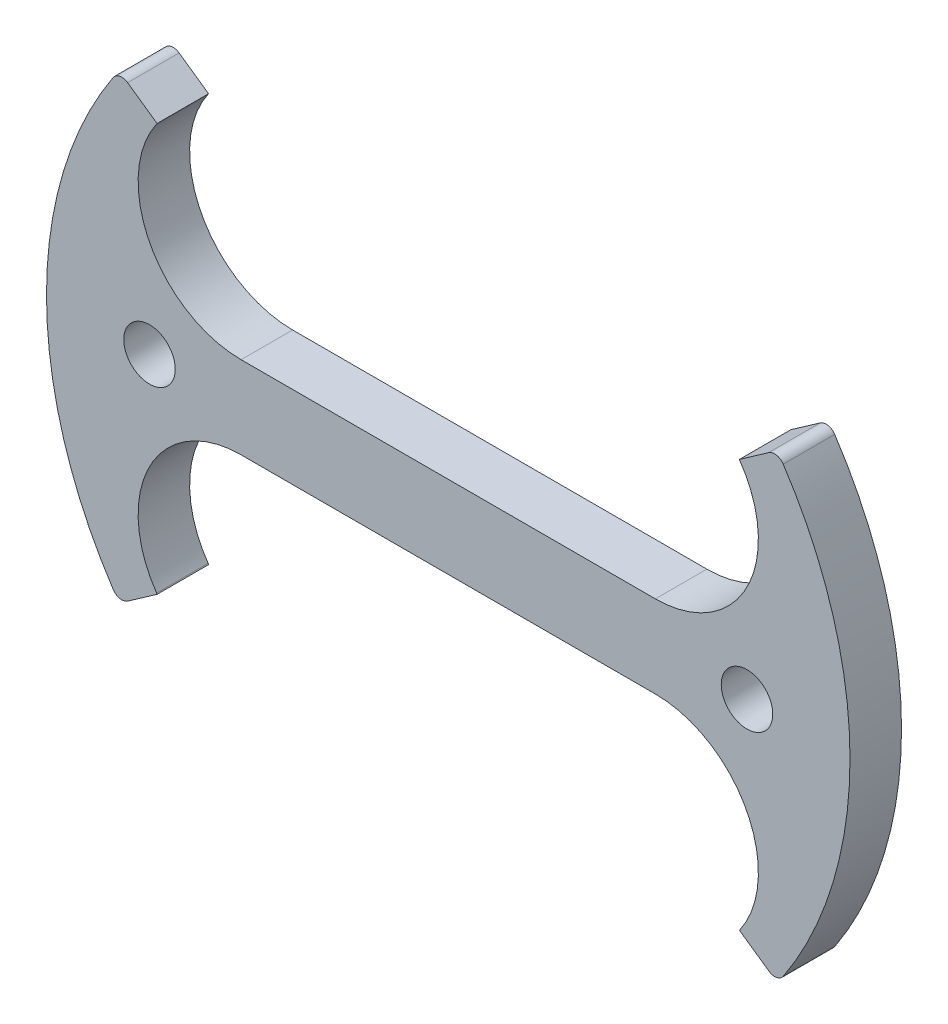
ISO-10303-21;
HEADER;
FILE_DESCRIPTION(('STEP AP214'),'2;1');
FILE_NAME('part.step','',(''),(''),'','','');
FILE_SCHEMA(('AUTOMOTIVE_DESIGN { 1 0 10303 214 1 1 1 1 }'));
ENDSEC;
DATA;
#1=APPLICATION_CONTEXT('core data for automotive mechanical design processes');
#2=APPLICATION_PROTOCOL_DEFINITION('international standard','automotive_design',2000,#1);
#3=PRODUCT_CONTEXT('',#1,'mechanical');
#4=PRODUCT('Part','Part','',(#3));
#5=PRODUCT_RELATED_PRODUCT_CATEGORY('part','',(#4));
#6=PRODUCT_DEFINITION_FORMATION('','',#4);
#7=PRODUCT_DEFINITION_CONTEXT('part definition',#1,'design');
#8=PRODUCT_DEFINITION('design','',#6,#7);
#9=PRODUCT_DEFINITION_SHAPE('','',#8);
#10=(LENGTH_UNIT() NAMED_UNIT(*) SI_UNIT(.MILLI.,.METRE.));
#11=(NAMED_UNIT(*) PLANE_ANGLE_UNIT() SI_UNIT($,.RADIAN.));
#12=(NAMED_UNIT(*) SI_UNIT($,.STERADIAN.) SOLID_ANGLE_UNIT());
#13=UNCERTAINTY_MEASURE_WITH_UNIT(LENGTH_MEASURE(1.E-05),#10,'distance_accuracy_value','');
#14=(GEOMETRIC_REPRESENTATION_CONTEXT(3) GLOBAL_UNCERTAINTY_ASSIGNED_CONTEXT((#13)) GLOBAL_UNIT_ASSIGNED_CONTEXT((#10,
#11,#12)) REPRESENTATION_CONTEXT('',''));
#15=CARTESIAN_POINT('',(0.,0.,0.));
#16=DIRECTION('',(0.,0.,1.));
#17=DIRECTION('',(1.,0.,0.));
#18=AXIS2_PLACEMENT_3D('',#15,#16,#17);
#19=CARTESIAN_POINT('',(0.,0.,6.35));
#20=DIRECTION('',(0.,0.,1.));
#21=DIRECTION('',(1.,0.,0.));
#22=AXIS2_PLACEMENT_3D('',#19,#20,#21);
#23=PLANE('',#22);
#24=CARTESIAN_POINT('',(36.83,0.,6.35));
#25=DIRECTION('',(0.,0.,-1.));
#26=DIRECTION('',(-1.,0.,0.));
#27=AXIS2_PLACEMENT_3D('',#24,#25,#26);
#28=CIRCLE('',#27,3.175);
#29=CARTESIAN_POINT('',(33.655,0.,6.35));
#30=VERTEX_POINT('',#29);
#31=EDGE_CURVE('E309',#30,#30,#28,.T.);
#32=ORIENTED_EDGE('',*,*,#31,.T.);
#33=EDGE_LOOP('',(#32));
#34=FACE_BOUND('',#33,.T.);
#35=CARTESIAN_POINT('',(-36.83,0.,6.35));
#36=DIRECTION('',(0.,0.,-1.));
#37=DIRECTION('',(1.,0.,0.));
#38=AXIS2_PLACEMENT_3D('',#35,#36,#37);
#39=CIRCLE('',#38,3.175);
#40=CARTESIAN_POINT('',(-33.655,0.,6.35));
#41=VERTEX_POINT('',#40);
#42=EDGE_CURVE('E467',#41,#41,#39,.T.);
#43=ORIENTED_EDGE('',*,*,#42,.T.);
#44=EDGE_LOOP('',(#43));
#45=FACE_BOUND('',#44,.T.);
#46=CARTESIAN_POINT('',(0.,0.,6.35));
#47=DIRECTION('',(0.,0.,1.));
#48=DIRECTION('',(1.,0.,0.));
#49=AXIS2_PLACEMENT_3D('',#46,#47,#48);
#50=CIRCLE('',#49,49.53);
#51=CARTESIAN_POINT('',(41.3142699154683,-27.3194436501153,6.35));
#52=VERTEX_POINT('',#51);
#53=CARTESIAN_POINT('',(41.2980489242587,27.343958291541,6.35));
#54=VERTEX_POINT('',#53);
#55=EDGE_CURVE('E216',#52,#54,#50,.T.);
#56=ORIENTED_EDGE('',*,*,#55,.T.);
#57=CARTESIAN_POINT('',(40.2391245928675,26.6428311558604,6.35));
#58=DIRECTION('',(0.,0.,1.));
#59=DIRECTION('',(1.,0.,0.));
#60=AXIS2_PLACEMENT_3D('',#57,#58,#59);
#61=CIRCLE('',#60,1.27);
#62=CARTESIAN_POINT('',(39.5103738420132,27.6829380461026,6.35));
#63=VERTEX_POINT('',#62);
#64=EDGE_CURVE('E11',#54,#63,#61,.T.);
#65=ORIENTED_EDGE('',*,*,#64,.T.);
#66=DIRECTION('',(-0.81898180334033,-0.573819488861628,0.));
#67=VECTOR('',#66,1.);
#68=CARTESIAN_POINT('',(40.5641687194466,28.4212792833164,6.35));
#69=LINE('',#68,#67);
#70=CARTESIAN_POINT('',(35.8836877133566,25.1419009044722,6.35));
#71=VERTEX_POINT('',#70);
#72=EDGE_CURVE('E178',#63,#71,#69,.T.);
#73=ORIENTED_EDGE('',*,*,#72,.T.);
#74=CARTESIAN_POINT('',(0.,0.,6.35));
#75=DIRECTION('',(0.,0.,1.));
#76=DIRECTION('',(1.,0.,0.));
#77=AXIS2_PLACEMENT_3D('',#74,#75,#76);
#78=CIRCLE('',#77,43.815);
#79=CARTESIAN_POINT('',(35.9568589082948,25.0371428571429,6.35));
#80=VERTEX_POINT('',#79);
#81=EDGE_CURVE('E185',#80,#71,#78,.T.);
#82=ORIENTED_EDGE('',*,*,#81,.F.);
#83=CARTESIAN_POINT('',(25.5345809638615,17.78,6.35));
#84=DIRECTION('',(0.,0.,1.));
#85=DIRECTION('',(1.,0.,0.));
#86=AXIS2_PLACEMENT_3D('',#83,#84,#85);
#87=CIRCLE('',#86,12.7);
#88=CARTESIAN_POINT('',(25.5345809638615,5.08,6.35));
#89=VERTEX_POINT('',#88);
#90=EDGE_CURVE('E228',#89,#80,#87,.T.);
#91=ORIENTED_EDGE('',*,*,#90,.F.);
#92=DIRECTION('',(1.,0.,0.));
#93=VECTOR('',#92,1.);
#94=CARTESIAN_POINT('',(-43.5195108543283,5.08,6.35));
#95=LINE('',#94,#93);
#96=CARTESIAN_POINT('',(-25.5345809638615,5.08,6.35));
#97=VERTEX_POINT('',#96);
#98=EDGE_CURVE('E203',#97,#89,#95,.T.);
#99=ORIENTED_EDGE('',*,*,#98,.F.);
#100=CARTESIAN_POINT('',(-25.5345809638615,17.78,6.35));
#101=DIRECTION('',(0.,0.,1.));
#102=DIRECTION('',(1.,0.,0.));
#103=AXIS2_PLACEMENT_3D('',#100,#101,#102);
#104=CIRCLE('',#103,12.7);
#105=CARTESIAN_POINT('',(-35.9568589082948,25.0371428571429,6.35));
#106=VERTEX_POINT('',#105);
#107=EDGE_CURVE('E240',#106,#97,#104,.T.);
#108=ORIENTED_EDGE('',*,*,#107,.F.);
#109=CARTESIAN_POINT('',(-35.8986027672387,25.1206,6.35));
#110=VERTEX_POINT('',#109);
#111=EDGE_CURVE('E204',#110,#106,#78,.T.);
#112=ORIENTED_EDGE('',*,*,#111,.F.);
#113=DIRECTION('',(-0.819322213105985,0.573333333333333,0.));
#114=VECTOR('',#113,1.);
#115=CARTESIAN_POINT('',(-35.8986027672387,25.1206,6.35));
#116=LINE('',#115,#114);
#117=CARTESIAN_POINT('',(-39.5267963278921,27.6594843056289,6.35));
#118=VERTEX_POINT('',#117);
#119=EDGE_CURVE('E190',#110,#118,#116,.T.);
#120=ORIENTED_EDGE('',*,*,#119,.T.);
#121=CARTESIAN_POINT('',(-40.2549296612255,26.6189450949843,6.35));
#122=DIRECTION('',(0.,0.,1.));
#123=DIRECTION('',(1.,0.,0.));
#124=AXIS2_PLACEMENT_3D('',#121,#122,#123);
#125=CIRCLE('',#124,1.27);
#126=CARTESIAN_POINT('',(-41.3142699154682,27.3194436501155,6.35));
#127=VERTEX_POINT('',#126);
#128=EDGE_CURVE('E266',#118,#127,#125,.T.);
#129=ORIENTED_EDGE('',*,*,#128,.T.);
#130=CARTESIAN_POINT('',(-41.2980489242587,-27.343958291541,6.35));
#131=VERTEX_POINT('',#130);
#132=EDGE_CURVE('E218',#127,#131,#50,.T.);
#133=ORIENTED_EDGE('',*,*,#132,.T.);
#134=CARTESIAN_POINT('',(-40.2391245928675,-26.6428311558604,6.35));
#135=DIRECTION('',(0.,0.,1.));
#136=DIRECTION('',(1.,0.,0.));
#137=AXIS2_PLACEMENT_3D('',#134,#135,#136);
#138=CIRCLE('',#137,1.27);
#139=CARTESIAN_POINT('',(-39.5103738420132,-27.6829380461027,6.35));
#140=VERTEX_POINT('',#139);
#141=EDGE_CURVE('E278',#131,#140,#138,.T.);
#142=ORIENTED_EDGE('',*,*,#141,.T.);
#143=DIRECTION('',(0.818981803340331,0.573819488861628,0.));
#144=VECTOR('',#143,1.);
#145=CARTESIAN_POINT('',(-35.8836877133566,-25.1419009044722,6.35));
#146=LINE('',#145,#144);
#147=CARTESIAN_POINT('',(-35.8836877133566,-25.1419009044722,6.35));
#148=VERTEX_POINT('',#147);
#149=EDGE_CURVE('E315',#140,#148,#146,.T.);
#150=ORIENTED_EDGE('',*,*,#149,.T.);
#151=CARTESIAN_POINT('',(0.,0.,6.35));
#152=DIRECTION('',(0.,0.,1.));
#153=DIRECTION('',(1.,0.,0.));
#154=AXIS2_PLACEMENT_3D('',#151,#152,#153);
#155=CIRCLE('',#154,43.815);
#156=CARTESIAN_POINT('',(-35.9568589082948,-25.0371428571429,6.35));
#157=VERTEX_POINT('',#156);
#158=EDGE_CURVE('E320',#157,#148,#155,.T.);
#159=ORIENTED_EDGE('',*,*,#158,.F.);
#160=CARTESIAN_POINT('',(-25.5345809638615,-17.78,6.35));
#161=DIRECTION('',(0.,0.,1.));
#162=DIRECTION('',(1.,0.,0.));
#163=AXIS2_PLACEMENT_3D('',#160,#161,#162);
#164=CIRCLE('',#163,12.7);
#165=CARTESIAN_POINT('',(-25.5345809638615,-5.08000000000001,6.35));
#166=VERTEX_POINT('',#165);
#167=EDGE_CURVE('E258',#166,#157,#164,.T.);
#168=ORIENTED_EDGE('',*,*,#167,.F.);
#169=DIRECTION('',(-1.,0.,0.));
#170=VECTOR('',#169,1.);
#171=CARTESIAN_POINT('',(-43.5195108543283,-5.08000000000001,6.35));
#172=LINE('',#171,#170);
#173=CARTESIAN_POINT('',(25.5345809638615,-5.08000000000001,6.35));
#174=VERTEX_POINT('',#173);
#175=EDGE_CURVE('E318',#174,#166,#172,.T.);
#176=ORIENTED_EDGE('',*,*,#175,.F.);
#177=CARTESIAN_POINT('',(25.5345809638615,-17.78,6.35));
#178=DIRECTION('',(0.,0.,1.));
#179=DIRECTION('',(1.,0.,0.));
#180=AXIS2_PLACEMENT_3D('',#177,#178,#179);
#181=CIRCLE('',#180,12.7);
#182=CARTESIAN_POINT('',(35.9568589082948,-25.0371428571428,6.35));
#183=VERTEX_POINT('',#182);
#184=EDGE_CURVE('E247',#183,#174,#181,.T.);
#185=ORIENTED_EDGE('',*,*,#184,.F.);
#186=CARTESIAN_POINT('',(35.8986027672388,-25.1205999999998,6.35));
#187=VERTEX_POINT('',#186);
#188=EDGE_CURVE('E321',#187,#183,#155,.T.);
#189=ORIENTED_EDGE('',*,*,#188,.F.);
#190=DIRECTION('',(0.819322213105986,-0.573333333333332,0.));
#191=VECTOR('',#190,1.);
#192=CARTESIAN_POINT('',(40.5810292151395,-28.3971999999998,6.35));
#193=LINE('',#192,#191);
#194=CARTESIAN_POINT('',(39.5267963278922,-27.6594843056288,6.35));
#195=VERTEX_POINT('',#194);
#196=EDGE_CURVE('E310',#187,#195,#193,.T.);
#197=ORIENTED_EDGE('',*,*,#196,.T.);
#198=CARTESIAN_POINT('',(40.2549296612256,-26.6189450949842,6.35));
#199=DIRECTION('',(0.,0.,1.));
#200=DIRECTION('',(1.,0.,0.));
#201=AXIS2_PLACEMENT_3D('',#198,#199,#200);
#202=CIRCLE('',#201,1.27);
#203=EDGE_CURVE('E288',#195,#52,#202,.T.);
#204=ORIENTED_EDGE('',*,*,#203,.T.);
#205=EDGE_LOOP('',(#56,#65,#73,#82,#91,#99,#108,#112,#120,#129,#133,#142,#150,#159,#168,#176,
#185,#189,#197,#204));
#206=FACE_BOUND('',#205,.T.);
#207=ADVANCED_FACE('F41',(#34,#45,#206),#23,.T.);
#208=CARTESIAN_POINT('',(0.,0.,0.));
#209=DIRECTION('',(0.,0.,1.));
#210=DIRECTION('',(1.,0.,0.));
#211=AXIS2_PLACEMENT_3D('',#208,#209,#210);
#212=PLANE('',#211);
#213=CARTESIAN_POINT('',(36.83,0.,0.));
#214=DIRECTION('',(0.,0.,-1.));
#215=DIRECTION('',(-1.,0.,0.));
#216=AXIS2_PLACEMENT_3D('',#213,#214,#215);
#217=CIRCLE('',#216,3.175);
#218=CARTESIAN_POINT('',(33.655,0.,0.));
#219=VERTEX_POINT('',#218);
#220=EDGE_CURVE('E462',#219,#219,#217,.T.);
#221=ORIENTED_EDGE('',*,*,#220,.F.);
#222=EDGE_LOOP('',(#221));
#223=FACE_BOUND('',#222,.T.);
#224=CARTESIAN_POINT('',(-36.83,0.,0.));
#225=DIRECTION('',(0.,0.,-1.));
#226=DIRECTION('',(1.,0.,0.));
#227=AXIS2_PLACEMENT_3D('',#224,#225,#226);
#228=CIRCLE('',#227,3.175);
#229=CARTESIAN_POINT('',(-33.655,0.,0.));
#230=VERTEX_POINT('',#229);
#231=EDGE_CURVE('E465',#230,#230,#228,.T.);
#232=ORIENTED_EDGE('',*,*,#231,.F.);
#233=EDGE_LOOP('',(#232));
#234=FACE_BOUND('',#233,.T.);
#235=DIRECTION('',(-0.81898180334033,-0.573819488861628,0.));
#236=VECTOR('',#235,1.);
#237=CARTESIAN_POINT('',(40.5641687194466,28.4212792833164,0.));
#238=LINE('',#237,#236);
#239=CARTESIAN_POINT('',(39.5103738420132,27.6829380461026,0.));
#240=VERTEX_POINT('',#239);
#241=CARTESIAN_POINT('',(35.8836877133566,25.1419009044722,0.));
#242=VERTEX_POINT('',#241);
#243=EDGE_CURVE('E192',#240,#242,#238,.T.);
#244=ORIENTED_EDGE('',*,*,#243,.F.);
#245=CARTESIAN_POINT('',(40.2391245928675,26.6428311558604,0.));
#246=DIRECTION('',(0.,0.,1.));
#247=DIRECTION('',(1.,0.,0.));
#248=AXIS2_PLACEMENT_3D('',#245,#246,#247);
#249=CIRCLE('',#248,1.27);
#250=CARTESIAN_POINT('',(41.2980489242587,27.343958291541,0.));
#251=VERTEX_POINT('',#250);
#252=EDGE_CURVE('E62',#240,#251,#249,.F.);
#253=ORIENTED_EDGE('',*,*,#252,.T.);
#254=CARTESIAN_POINT('',(0.,0.,0.));
#255=DIRECTION('',(0.,0.,1.));
#256=DIRECTION('',(1.,0.,0.));
#257=AXIS2_PLACEMENT_3D('',#254,#255,#256);
#258=CIRCLE('',#257,49.53);
#259=CARTESIAN_POINT('',(41.3142699154683,-27.3194436501153,0.));
#260=VERTEX_POINT('',#259);
#261=EDGE_CURVE('E207',#260,#251,#258,.T.);
#262=ORIENTED_EDGE('',*,*,#261,.F.);
#263=CARTESIAN_POINT('',(40.2549296612256,-26.6189450949842,0.));
#264=DIRECTION('',(0.,0.,1.));
#265=DIRECTION('',(1.,0.,0.));
#266=AXIS2_PLACEMENT_3D('',#263,#264,#265);
#267=CIRCLE('',#266,1.27);
#268=CARTESIAN_POINT('',(39.5267963278922,-27.6594843056288,0.));
#269=VERTEX_POINT('',#268);
#270=EDGE_CURVE('E283',#260,#269,#267,.F.);
#271=ORIENTED_EDGE('',*,*,#270,.T.);
#272=DIRECTION('',(0.819322213105986,-0.573333333333332,0.));
#273=VECTOR('',#272,1.);
#274=CARTESIAN_POINT('',(40.5810292151395,-28.3971999999998,0.));
#275=LINE('',#274,#273);
#276=CARTESIAN_POINT('',(35.8986027672388,-25.1205999999998,0.));
#277=VERTEX_POINT('',#276);
#278=EDGE_CURVE('E296',#277,#269,#275,.T.);
#279=ORIENTED_EDGE('',*,*,#278,.F.);
#280=CARTESIAN_POINT('',(0.,0.,0.));
#281=DIRECTION('',(0.,0.,1.));
#282=DIRECTION('',(1.,0.,0.));
#283=AXIS2_PLACEMENT_3D('',#280,#281,#282);
#284=CIRCLE('',#283,43.815);
#285=CARTESIAN_POINT('',(35.9568589082948,-25.0371428571428,0.));
#286=VERTEX_POINT('',#285);
#287=EDGE_CURVE('E305',#277,#286,#284,.T.);
#288=ORIENTED_EDGE('',*,*,#287,.T.);
#289=CARTESIAN_POINT('',(25.5345809638615,-17.78,0.));
#290=DIRECTION('',(0.,0.,1.));
#291=DIRECTION('',(1.,0.,0.));
#292=AXIS2_PLACEMENT_3D('',#289,#290,#291);
#293=CIRCLE('',#292,12.7);
#294=CARTESIAN_POINT('',(25.5345809638615,-5.08000000000001,0.));
#295=VERTEX_POINT('',#294);
#296=EDGE_CURVE('E249',#295,#286,#293,.F.);
#297=ORIENTED_EDGE('',*,*,#296,.F.);
#298=DIRECTION('',(-1.,0.,0.));
#299=VECTOR('',#298,1.);
#300=CARTESIAN_POINT('',(-43.5195108543283,-5.08000000000001,0.));
#301=LINE('',#300,#299);
#302=CARTESIAN_POINT('',(-25.5345809638615,-5.08000000000001,0.));
#303=VERTEX_POINT('',#302);
#304=EDGE_CURVE('E208',#295,#303,#301,.T.);
#305=ORIENTED_EDGE('',*,*,#304,.T.);
#306=CARTESIAN_POINT('',(-25.5345809638615,-17.78,0.));
#307=DIRECTION('',(0.,0.,1.));
#308=DIRECTION('',(1.,0.,0.));
#309=AXIS2_PLACEMENT_3D('',#306,#307,#308);
#310=CIRCLE('',#309,12.7);
#311=CARTESIAN_POINT('',(-35.9568589082948,-25.0371428571429,0.));
#312=VERTEX_POINT('',#311);
#313=EDGE_CURVE('E264',#312,#303,#310,.F.);
#314=ORIENTED_EDGE('',*,*,#313,.F.);
#315=CARTESIAN_POINT('',(-35.8836877133566,-25.1419009044722,0.));
#316=VERTEX_POINT('',#315);
#317=EDGE_CURVE('E322',#312,#316,#284,.T.);
#318=ORIENTED_EDGE('',*,*,#317,.T.);
#319=DIRECTION('',(0.818981803340331,0.573819488861628,0.));
#320=VECTOR('',#319,1.);
#321=CARTESIAN_POINT('',(-35.8836877133566,-25.1419009044722,0.));
#322=LINE('',#321,#320);
#323=CARTESIAN_POINT('',(-39.5103738420132,-27.6829380461027,0.));
#324=VERTEX_POINT('',#323);
#325=EDGE_CURVE('E295',#324,#316,#322,.T.);
#326=ORIENTED_EDGE('',*,*,#325,.F.);
#327=CARTESIAN_POINT('',(-40.2391245928675,-26.6428311558604,0.));
#328=DIRECTION('',(0.,0.,1.));
#329=DIRECTION('',(1.,0.,0.));
#330=AXIS2_PLACEMENT_3D('',#327,#328,#329);
#331=CIRCLE('',#330,1.27);
#332=CARTESIAN_POINT('',(-41.2980489242587,-27.343958291541,0.));
#333=VERTEX_POINT('',#332);
#334=EDGE_CURVE('E273',#324,#333,#331,.F.);
#335=ORIENTED_EDGE('',*,*,#334,.T.);
#336=CARTESIAN_POINT('',(-41.3142699154682,27.3194436501155,0.));
#337=VERTEX_POINT('',#336);
#338=EDGE_CURVE('E217',#337,#333,#258,.T.);
#339=ORIENTED_EDGE('',*,*,#338,.F.);
#340=CARTESIAN_POINT('',(-40.2549296612255,26.6189450949843,0.));
#341=DIRECTION('',(0.,0.,1.));
#342=DIRECTION('',(1.,0.,0.));
#343=AXIS2_PLACEMENT_3D('',#340,#341,#342);
#344=CIRCLE('',#343,1.27);
#345=CARTESIAN_POINT('',(-39.5267963278921,27.6594843056289,0.));
#346=VERTEX_POINT('',#345);
#347=EDGE_CURVE('E267',#337,#346,#344,.F.);
#348=ORIENTED_EDGE('',*,*,#347,.T.);
#349=DIRECTION('',(-0.819322213105985,0.573333333333333,0.));
#350=VECTOR('',#349,1.);
#351=CARTESIAN_POINT('',(-35.8986027672387,25.1206,0.));
#352=LINE('',#351,#350);
#353=CARTESIAN_POINT('',(-35.8986027672387,25.1206,0.));
#354=VERTEX_POINT('',#353);
#355=EDGE_CURVE('E189',#354,#346,#352,.T.);
#356=ORIENTED_EDGE('',*,*,#355,.F.);
#357=CARTESIAN_POINT('',(0.,0.,0.));
#358=DIRECTION('',(0.,0.,1.));
#359=DIRECTION('',(1.,0.,0.));
#360=AXIS2_PLACEMENT_3D('',#357,#358,#359);
#361=CIRCLE('',#360,43.815);
#362=CARTESIAN_POINT('',(-35.9568589082948,25.0371428571429,0.));
#363=VERTEX_POINT('',#362);
#364=EDGE_CURVE('E214',#354,#363,#361,.T.);
#365=ORIENTED_EDGE('',*,*,#364,.T.);
#366=CARTESIAN_POINT('',(-25.5345809638615,17.78,0.));
#367=DIRECTION('',(0.,0.,1.));
#368=DIRECTION('',(1.,0.,0.));
#369=AXIS2_PLACEMENT_3D('',#366,#367,#368);
#370=CIRCLE('',#369,12.7);
#371=CARTESIAN_POINT('',(-25.5345809638615,5.08,0.));
#372=VERTEX_POINT('',#371);
#373=EDGE_CURVE('E237',#372,#363,#370,.F.);
#374=ORIENTED_EDGE('',*,*,#373,.F.);
#375=DIRECTION('',(1.,0.,0.));
#376=VECTOR('',#375,1.);
#377=CARTESIAN_POINT('',(-43.5195108543283,5.08,0.));
#378=LINE('',#377,#376);
#379=CARTESIAN_POINT('',(25.5345809638615,5.08,0.));
#380=VERTEX_POINT('',#379);
#381=EDGE_CURVE('E206',#372,#380,#378,.T.);
#382=ORIENTED_EDGE('',*,*,#381,.T.);
#383=CARTESIAN_POINT('',(25.5345809638615,17.78,0.));
#384=DIRECTION('',(0.,0.,1.));
#385=DIRECTION('',(1.,0.,0.));
#386=AXIS2_PLACEMENT_3D('',#383,#384,#385);
#387=CIRCLE('',#386,12.7);
#388=CARTESIAN_POINT('',(35.9568589082948,25.0371428571429,0.));
#389=VERTEX_POINT('',#388);
#390=EDGE_CURVE('E226',#389,#380,#387,.F.);
#391=ORIENTED_EDGE('',*,*,#390,.F.);
#392=EDGE_CURVE('E212',#389,#242,#361,.T.);
#393=ORIENTED_EDGE('',*,*,#392,.T.);
#394=EDGE_LOOP('',(#244,#253,#262,#271,#279,#288,#297,#305,#314,#318,#326,#335,#339,#348,#356,
#365,#374,#382,#391,#393));
#395=FACE_BOUND('',#394,.T.);
#396=ADVANCED_FACE('F291',(#223,#234,#395),#212,.F.);
#397=CARTESIAN_POINT('',(0.,0.,6.35));
#398=DIRECTION('',(0.,0.,-1.));
#399=DIRECTION('',(-1.,0.,0.));
#400=AXIS2_PLACEMENT_3D('',#397,#398,#399);
#401=CYLINDRICAL_SURFACE('',#400,49.53);
#402=ORIENTED_EDGE('',*,*,#261,.T.);
#403=DIRECTION('',(0.,0.,-1.));
#404=VECTOR('',#403,1.);
#405=CARTESIAN_POINT('',(41.2980489242587,27.343958291541,6.35));
#406=LINE('',#405,#404);
#407=EDGE_CURVE('E47',#251,#54,#406,.F.);
#408=ORIENTED_EDGE('',*,*,#407,.T.);
#409=ORIENTED_EDGE('',*,*,#55,.F.);
#410=DIRECTION('',(0.,0.,-1.));
#411=VECTOR('',#410,1.);
#412=CARTESIAN_POINT('',(41.3142699154683,-27.3194436501153,6.35));
#413=LINE('',#412,#411);
#414=EDGE_CURVE('E284',#52,#260,#413,.T.);
#415=ORIENTED_EDGE('',*,*,#414,.T.);
#416=EDGE_LOOP('',(#402,#408,#409,#415));
#417=FACE_BOUND('',#416,.T.);
#418=ADVANCED_FACE('F407',(#417),#401,.T.);
#419=CARTESIAN_POINT('',(0.,0.,6.35));
#420=DIRECTION('',(0.,0.,-1.));
#421=DIRECTION('',(-1.,0.,0.));
#422=AXIS2_PLACEMENT_3D('',#419,#420,#421);
#423=CYLINDRICAL_SURFACE('',#422,43.815);
#424=ORIENTED_EDGE('',*,*,#81,.T.);
#425=DIRECTION('',(0.,0.,-1.));
#426=VECTOR('',#425,1.);
#427=CARTESIAN_POINT('',(35.8836877133566,25.1419009044722,6.35));
#428=LINE('',#427,#426);
#429=EDGE_CURVE('E191',#71,#242,#428,.T.);
#430=ORIENTED_EDGE('',*,*,#429,.T.);
#431=ORIENTED_EDGE('',*,*,#392,.F.);
#432=DIRECTION('',(0.,0.,-1.));
#433=VECTOR('',#432,1.);
#434=CARTESIAN_POINT('',(35.9568589082948,25.0371428571429,6.35));
#435=LINE('',#434,#433);
#436=EDGE_CURVE('E205',#389,#80,#435,.F.);
#437=ORIENTED_EDGE('',*,*,#436,.T.);
#438=EDGE_LOOP('',(#424,#430,#431,#437));
#439=FACE_BOUND('',#438,.T.);
#440=ADVANCED_FACE('F197',(#439),#423,.F.);
#441=CARTESIAN_POINT('',(0.,0.,6.35));
#442=DIRECTION('',(0.,0.,-1.));
#443=DIRECTION('',(-1.,0.,0.));
#444=AXIS2_PLACEMENT_3D('',#441,#442,#443);
#445=CYLINDRICAL_SURFACE('',#444,43.815);
#446=ORIENTED_EDGE('',*,*,#158,.T.);
#447=DIRECTION('',(0.,0.,-1.));
#448=VECTOR('',#447,1.);
#449=CARTESIAN_POINT('',(-35.8836877133566,-25.1419009044722,6.35));
#450=LINE('',#449,#448);
#451=EDGE_CURVE('E302',#148,#316,#450,.T.);
#452=ORIENTED_EDGE('',*,*,#451,.T.);
#453=ORIENTED_EDGE('',*,*,#317,.F.);
#454=DIRECTION('',(0.,0.,-1.));
#455=VECTOR('',#454,1.);
#456=CARTESIAN_POINT('',(-35.9568589082948,-25.0371428571429,6.35));
#457=LINE('',#456,#455);
#458=EDGE_CURVE('E256',#312,#157,#457,.F.);
#459=ORIENTED_EDGE('',*,*,#458,.T.);
#460=EDGE_LOOP('',(#446,#452,#453,#459));
#461=FACE_BOUND('',#460,.T.);
#462=ADVANCED_FACE('F348',(#461),#445,.F.);
#463=CARTESIAN_POINT('',(-25.5345809638615,-17.78,6.35));
#464=DIRECTION('',(0.,0.,-1.));
#465=DIRECTION('',(-1.,0.,0.));
#466=AXIS2_PLACEMENT_3D('',#463,#464,#465);
#467=CYLINDRICAL_SURFACE('',#466,12.7);
#468=DIRECTION('',(0.,0.,1.));
#469=VECTOR('',#468,1.);
#470=CARTESIAN_POINT('',(-25.5345809638615,-5.08000000000001,6.35));
#471=LINE('',#470,#469);
#472=EDGE_CURVE('E254',#166,#303,#471,.F.);
#473=ORIENTED_EDGE('',*,*,#472,.F.);
#474=ORIENTED_EDGE('',*,*,#167,.T.);
#475=ORIENTED_EDGE('',*,*,#458,.F.);
#476=ORIENTED_EDGE('',*,*,#313,.T.);
#477=EDGE_LOOP('',(#473,#474,#475,#476));
#478=FACE_BOUND('',#477,.T.);
#479=ADVANCED_FACE('F349',(#478),#467,.F.);
#480=CARTESIAN_POINT('',(25.5345809638615,-17.78,6.35));
#481=DIRECTION('',(0.,0.,-1.));
#482=DIRECTION('',(-1.,0.,0.));
#483=AXIS2_PLACEMENT_3D('',#480,#481,#482);
#484=CYLINDRICAL_SURFACE('',#483,12.7);
#485=DIRECTION('',(0.,0.,-1.));
#486=VECTOR('',#485,1.);
#487=CARTESIAN_POINT('',(35.9568589082948,-25.0371428571429,6.35));
#488=LINE('',#487,#486);
#489=EDGE_CURVE('E245',#183,#286,#488,.T.);
#490=ORIENTED_EDGE('',*,*,#489,.F.);
#491=ORIENTED_EDGE('',*,*,#184,.T.);
#492=DIRECTION('',(0.,0.,1.));
#493=VECTOR('',#492,1.);
#494=CARTESIAN_POINT('',(25.5345809638615,-5.08000000000001,6.35));
#495=LINE('',#494,#493);
#496=EDGE_CURVE('E244',#295,#174,#495,.T.);
#497=ORIENTED_EDGE('',*,*,#496,.F.);
#498=ORIENTED_EDGE('',*,*,#296,.T.);
#499=EDGE_LOOP('',(#490,#491,#497,#498));
#500=FACE_BOUND('',#499,.T.);
#501=ADVANCED_FACE('F331',(#500),#484,.F.);
#502=CARTESIAN_POINT('',(-25.5345809638615,17.78,6.35));
#503=DIRECTION('',(0.,0.,-1.));
#504=DIRECTION('',(-1.,0.,0.));
#505=AXIS2_PLACEMENT_3D('',#502,#503,#504);
#506=CYLINDRICAL_SURFACE('',#505,12.7);
#507=DIRECTION('',(0.,0.,-1.));
#508=VECTOR('',#507,1.);
#509=CARTESIAN_POINT('',(-35.9568589082948,25.0371428571429,6.35));
#510=LINE('',#509,#508);
#511=EDGE_CURVE('E233',#106,#363,#510,.T.);
#512=ORIENTED_EDGE('',*,*,#511,.F.);
#513=ORIENTED_EDGE('',*,*,#107,.T.);
#514=DIRECTION('',(0.,0.,1.));
#515=VECTOR('',#514,1.);
#516=CARTESIAN_POINT('',(-25.5345809638615,5.08,6.35));
#517=LINE('',#516,#515);
#518=EDGE_CURVE('E234',#372,#97,#517,.T.);
#519=ORIENTED_EDGE('',*,*,#518,.F.);
#520=ORIENTED_EDGE('',*,*,#373,.T.);
#521=EDGE_LOOP('',(#512,#513,#519,#520));
#522=FACE_BOUND('',#521,.T.);
#523=ADVANCED_FACE('F381',(#522),#506,.F.);
#524=CARTESIAN_POINT('',(25.5345809638615,17.78,6.35));
#525=DIRECTION('',(0.,0.,-1.));
#526=DIRECTION('',(-1.,0.,0.));
#527=AXIS2_PLACEMENT_3D('',#524,#525,#526);
#528=CYLINDRICAL_SURFACE('',#527,12.7);
#529=DIRECTION('',(0.,0.,1.));
#530=VECTOR('',#529,1.);
#531=CARTESIAN_POINT('',(25.5345809638615,5.08,6.35));
#532=LINE('',#531,#530);
#533=EDGE_CURVE('E225',#89,#380,#532,.F.);
#534=ORIENTED_EDGE('',*,*,#533,.F.);
#535=ORIENTED_EDGE('',*,*,#90,.T.);
#536=ORIENTED_EDGE('',*,*,#436,.F.);
#537=ORIENTED_EDGE('',*,*,#390,.T.);
#538=EDGE_LOOP('',(#534,#535,#536,#537));
#539=FACE_BOUND('',#538,.T.);
#540=ADVANCED_FACE('F388',(#539),#528,.F.);
#541=ORIENTED_EDGE('',*,*,#338,.T.);
#542=DIRECTION('',(0.,0.,-1.));
#543=VECTOR('',#542,1.);
#544=CARTESIAN_POINT('',(-41.2980489242587,-27.343958291541,6.35));
#545=LINE('',#544,#543);
#546=EDGE_CURVE('E280',#333,#131,#545,.F.);
#547=ORIENTED_EDGE('',*,*,#546,.T.);
#548=ORIENTED_EDGE('',*,*,#132,.F.);
#549=DIRECTION('',(0.,0.,-1.));
#550=VECTOR('',#549,1.);
#551=CARTESIAN_POINT('',(-41.3142699154682,27.3194436501155,6.35));
#552=LINE('',#551,#550);
#553=EDGE_CURVE('E265',#127,#337,#552,.T.);
#554=ORIENTED_EDGE('',*,*,#553,.T.);
#555=EDGE_LOOP('',(#541,#547,#548,#554));
#556=FACE_BOUND('',#555,.T.);
#557=ADVANCED_FACE('F359',(#556),#401,.T.);
#558=DIRECTION('',(0.,0.,-1.));
#559=VECTOR('',#558,1.);
#560=CARTESIAN_POINT('',(-35.8986027672387,25.1206,6.35));
#561=LINE('',#560,#559);
#562=EDGE_CURVE('E196',#110,#354,#561,.T.);
#563=ORIENTED_EDGE('',*,*,#562,.F.);
#564=ORIENTED_EDGE('',*,*,#111,.T.);
#565=ORIENTED_EDGE('',*,*,#511,.T.);
#566=ORIENTED_EDGE('',*,*,#364,.F.);
#567=EDGE_LOOP('',(#563,#564,#565,#566));
#568=FACE_BOUND('',#567,.T.);
#569=ADVANCED_FACE('F377',(#568),#423,.F.);
#570=CARTESIAN_POINT('',(-43.5195108543283,5.08,6.35));
#571=DIRECTION('',(0.,1.,0.));
#572=DIRECTION('',(0.,0.,1.));
#573=AXIS2_PLACEMENT_3D('',#570,#571,#572);
#574=PLANE('',#573);
#575=ORIENTED_EDGE('',*,*,#381,.F.);
#576=ORIENTED_EDGE('',*,*,#518,.T.);
#577=ORIENTED_EDGE('',*,*,#98,.T.);
#578=ORIENTED_EDGE('',*,*,#533,.T.);
#579=EDGE_LOOP('',(#575,#576,#577,#578));
#580=FACE_BOUND('',#579,.T.);
#581=ADVANCED_FACE('F389',(#580),#574,.T.);
#582=DIRECTION('',(0.,0.,-1.));
#583=VECTOR('',#582,1.);
#584=CARTESIAN_POINT('',(35.8986027672388,-25.1205999999998,6.35));
#585=LINE('',#584,#583);
#586=EDGE_CURVE('E308',#187,#277,#585,.T.);
#587=ORIENTED_EDGE('',*,*,#586,.F.);
#588=ORIENTED_EDGE('',*,*,#188,.T.);
#589=ORIENTED_EDGE('',*,*,#489,.T.);
#590=ORIENTED_EDGE('',*,*,#287,.F.);
#591=EDGE_LOOP('',(#587,#588,#589,#590));
#592=FACE_BOUND('',#591,.T.);
#593=ADVANCED_FACE('F340',(#592),#445,.F.);
#594=CARTESIAN_POINT('',(-43.5195108543283,-5.08000000000001,6.35));
#595=DIRECTION('',(0.,-1.,0.));
#596=DIRECTION('',(0.,0.,-1.));
#597=AXIS2_PLACEMENT_3D('',#594,#595,#596);
#598=PLANE('',#597);
#599=ORIENTED_EDGE('',*,*,#175,.T.);
#600=ORIENTED_EDGE('',*,*,#472,.T.);
#601=ORIENTED_EDGE('',*,*,#304,.F.);
#602=ORIENTED_EDGE('',*,*,#496,.T.);
#603=EDGE_LOOP('',(#599,#600,#601,#602));
#604=FACE_BOUND('',#603,.T.);
#605=ADVANCED_FACE('F345',(#604),#598,.T.);
#606=CARTESIAN_POINT('',(40.5810292151395,-28.3971999999998,6.35));
#607=DIRECTION('',(0.573333333333332,0.819322213105986,0.));
#608=DIRECTION('',(-0.819322213105986,0.573333333333332,0.));
#609=AXIS2_PLACEMENT_3D('',#606,#607,#608);
#610=PLANE('',#609);
#611=ORIENTED_EDGE('',*,*,#278,.T.);
#612=DIRECTION('',(0.,0.,-1.));
#613=VECTOR('',#612,1.);
#614=CARTESIAN_POINT('',(39.5267963278922,-27.6594843056288,6.35));
#615=LINE('',#614,#613);
#616=EDGE_CURVE('E287',#269,#195,#615,.F.);
#617=ORIENTED_EDGE('',*,*,#616,.T.);
#618=ORIENTED_EDGE('',*,*,#196,.F.);
#619=ORIENTED_EDGE('',*,*,#586,.T.);
#620=EDGE_LOOP('',(#611,#617,#618,#619));
#621=FACE_BOUND('',#620,.T.);
#622=ADVANCED_FACE('F436',(#621),#610,.F.);
#623=CARTESIAN_POINT('',(-35.8836877133566,-25.1419009044722,6.35));
#624=DIRECTION('',(-0.573819488861628,0.818981803340331,0.));
#625=DIRECTION('',(-0.818981803340331,-0.573819488861628,0.));
#626=AXIS2_PLACEMENT_3D('',#623,#624,#625);
#627=PLANE('',#626);
#628=ORIENTED_EDGE('',*,*,#149,.F.);
#629=DIRECTION('',(0.,0.,-1.));
#630=VECTOR('',#629,1.);
#631=CARTESIAN_POINT('',(-39.5103738420132,-27.6829380461027,6.35));
#632=LINE('',#631,#630);
#633=EDGE_CURVE('E275',#140,#324,#632,.T.);
#634=ORIENTED_EDGE('',*,*,#633,.T.);
#635=ORIENTED_EDGE('',*,*,#325,.T.);
#636=ORIENTED_EDGE('',*,*,#451,.F.);
#637=EDGE_LOOP('',(#628,#634,#635,#636));
#638=FACE_BOUND('',#637,.T.);
#639=ADVANCED_FACE('F353',(#638),#627,.F.);
#640=CARTESIAN_POINT('',(-35.8986027672387,25.1206,6.35));
#641=DIRECTION('',(-0.573333333333333,-0.819322213105985,0.));
#642=DIRECTION('',(0.819322213105985,-0.573333333333333,0.));
#643=AXIS2_PLACEMENT_3D('',#640,#641,#642);
#644=PLANE('',#643);
#645=ORIENTED_EDGE('',*,*,#355,.T.);
#646=DIRECTION('',(0.,0.,-1.));
#647=VECTOR('',#646,1.);
#648=CARTESIAN_POINT('',(-39.5267963278921,27.6594843056289,6.35));
#649=LINE('',#648,#647);
#650=EDGE_CURVE('E268',#346,#118,#649,.F.);
#651=ORIENTED_EDGE('',*,*,#650,.T.);
#652=ORIENTED_EDGE('',*,*,#119,.F.);
#653=ORIENTED_EDGE('',*,*,#562,.T.);
#654=EDGE_LOOP('',(#645,#651,#652,#653));
#655=FACE_BOUND('',#654,.T.);
#656=ADVANCED_FACE('F372',(#655),#644,.F.);
#657=CARTESIAN_POINT('',(40.5641687194466,28.4212792833164,6.35));
#658=DIRECTION('',(0.573819488861628,-0.81898180334033,0.));
#659=DIRECTION('',(0.81898180334033,0.573819488861628,0.));
#660=AXIS2_PLACEMENT_3D('',#657,#658,#659);
#661=PLANE('',#660);
#662=ORIENTED_EDGE('',*,*,#72,.F.);
#663=DIRECTION('',(0.,0.,-1.));
#664=VECTOR('',#663,1.);
#665=CARTESIAN_POINT('',(39.5103738420132,27.6829380461026,6.35));
#666=LINE('',#665,#664);
#667=EDGE_CURVE('E286',#63,#240,#666,.T.);
#668=ORIENTED_EDGE('',*,*,#667,.T.);
#669=ORIENTED_EDGE('',*,*,#243,.T.);
#670=ORIENTED_EDGE('',*,*,#429,.F.);
#671=EDGE_LOOP('',(#662,#668,#669,#670));
#672=FACE_BOUND('',#671,.T.);
#673=ADVANCED_FACE('F195',(#672),#661,.F.);
#674=CARTESIAN_POINT('',(-36.83,0.,6.35));
#675=DIRECTION('',(0.,0.,-1.));
#676=DIRECTION('',(-1.,0.,0.));
#677=AXIS2_PLACEMENT_3D('',#674,#675,#676);
#678=CYLINDRICAL_SURFACE('',#677,3.175);
#679=ORIENTED_EDGE('',*,*,#42,.F.);
#680=EDGE_LOOP('',(#679));
#681=FACE_BOUND('',#680,.T.);
#682=ORIENTED_EDGE('',*,*,#231,.T.);
#683=EDGE_LOOP('',(#682));
#684=FACE_BOUND('',#683,.T.);
#685=ADVANCED_FACE('F450',(#681,#684),#678,.F.);
#686=CARTESIAN_POINT('',(36.83,0.,6.35));
#687=DIRECTION('',(0.,0.,-1.));
#688=DIRECTION('',(-1.,0.,0.));
#689=AXIS2_PLACEMENT_3D('',#686,#687,#688);
#690=CYLINDRICAL_SURFACE('',#689,3.175);
#691=ORIENTED_EDGE('',*,*,#31,.F.);
#692=EDGE_LOOP('',(#691));
#693=FACE_BOUND('',#692,.T.);
#694=ORIENTED_EDGE('',*,*,#220,.T.);
#695=EDGE_LOOP('',(#694));
#696=FACE_BOUND('',#695,.T.);
#697=ADVANCED_FACE('F425',(#693,#696),#690,.F.);
#698=CARTESIAN_POINT('',(-40.2549296612255,26.6189450949843,6.35));
#699=DIRECTION('',(0.,0.,-1.));
#700=DIRECTION('',(-1.,0.,0.));
#701=AXIS2_PLACEMENT_3D('',#698,#699,#700);
#702=CYLINDRICAL_SURFACE('',#701,1.27);
#703=ORIENTED_EDGE('',*,*,#128,.F.);
#704=ORIENTED_EDGE('',*,*,#650,.F.);
#705=ORIENTED_EDGE('',*,*,#347,.F.);
#706=ORIENTED_EDGE('',*,*,#553,.F.);
#707=EDGE_LOOP('',(#703,#704,#705,#706));
#708=FACE_BOUND('',#707,.T.);
#709=ADVANCED_FACE('F367',(#708),#702,.T.);
#710=CARTESIAN_POINT('',(-40.2391245928675,-26.6428311558604,6.35));
#711=DIRECTION('',(0.,0.,-1.));
#712=DIRECTION('',(-1.,0.,0.));
#713=AXIS2_PLACEMENT_3D('',#710,#711,#712);
#714=CYLINDRICAL_SURFACE('',#713,1.27);
#715=ORIENTED_EDGE('',*,*,#141,.F.);
#716=ORIENTED_EDGE('',*,*,#546,.F.);
#717=ORIENTED_EDGE('',*,*,#334,.F.);
#718=ORIENTED_EDGE('',*,*,#633,.F.);
#719=EDGE_LOOP('',(#715,#716,#717,#718));
#720=FACE_BOUND('',#719,.T.);
#721=ADVANCED_FACE('F362',(#720),#714,.T.);
#722=CARTESIAN_POINT('',(40.2549296612256,-26.6189450949842,6.35));
#723=DIRECTION('',(0.,0.,-1.));
#724=DIRECTION('',(-1.,0.,0.));
#725=AXIS2_PLACEMENT_3D('',#722,#723,#724);
#726=CYLINDRICAL_SURFACE('',#725,1.27);
#727=ORIENTED_EDGE('',*,*,#203,.F.);
#728=ORIENTED_EDGE('',*,*,#616,.F.);
#729=ORIENTED_EDGE('',*,*,#270,.F.);
#730=ORIENTED_EDGE('',*,*,#414,.F.);
#731=EDGE_LOOP('',(#727,#728,#729,#730));
#732=FACE_BOUND('',#731,.T.);
#733=ADVANCED_FACE('F428',(#732),#726,.T.);
#734=CARTESIAN_POINT('',(40.2391245928675,26.6428311558604,6.35));
#735=DIRECTION('',(0.,0.,-1.));
#736=DIRECTION('',(-1.,0.,0.));
#737=AXIS2_PLACEMENT_3D('',#734,#735,#736);
#738=CYLINDRICAL_SURFACE('',#737,1.27);
#739=ORIENTED_EDGE('',*,*,#64,.F.);
#740=ORIENTED_EDGE('',*,*,#407,.F.);
#741=ORIENTED_EDGE('',*,*,#252,.F.);
#742=ORIENTED_EDGE('',*,*,#667,.F.);
#743=EDGE_LOOP('',(#739,#740,#741,#742));
#744=FACE_BOUND('',#743,.T.);
#745=ADVANCED_FACE('F43',(#744),#738,.T.);
#746=CLOSED_SHELL('',(#207,#396,#418,#440,#462,#479,#501,#523,#540,#557,#569,#581,#593,#605,
#622,#639,#656,#673,#685,#697,#709,#721,#733,#745));
#747=MANIFOLD_SOLID_BREP('B2',#746);
#748=ADVANCED_BREP_SHAPE_REPRESENTATION('',(#18,#747),#14);
#749=SHAPE_DEFINITION_REPRESENTATION(#9,#748);
ENDSEC;
END-ISO-10303-21;
